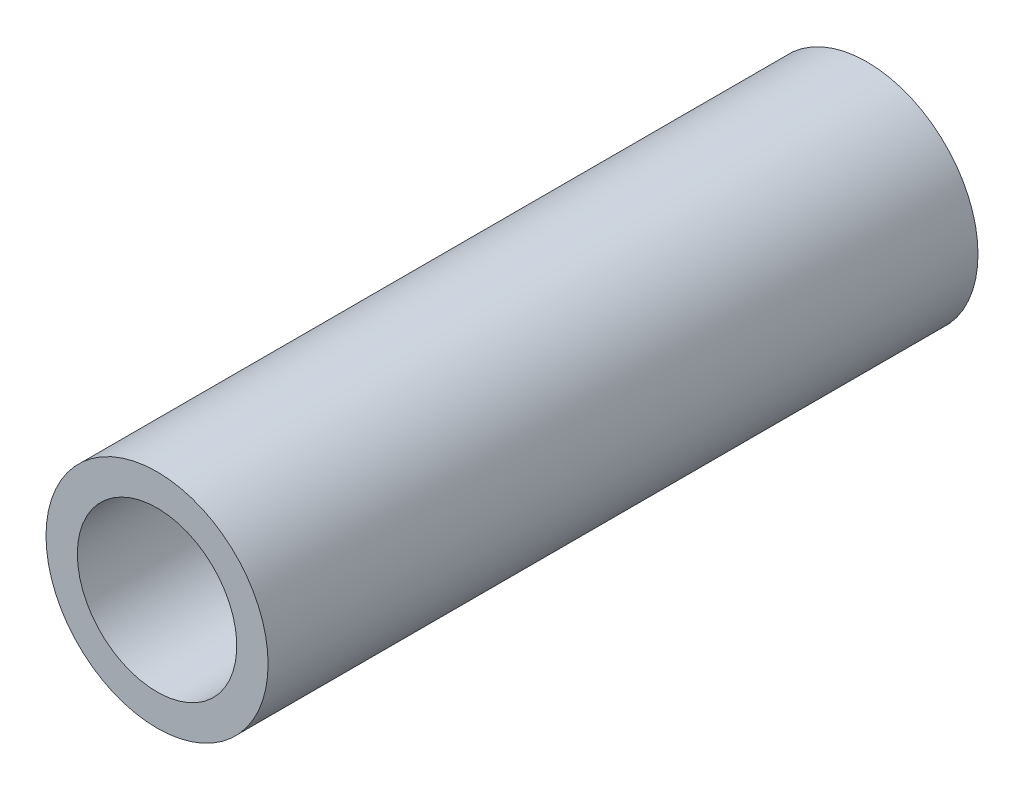
ISO-10303-21;
HEADER;
FILE_DESCRIPTION(('STEP AP214'),'2;1');
FILE_NAME('part.step','',(''),(''),'','','');
FILE_SCHEMA(('AUTOMOTIVE_DESIGN { 1 0 10303 214 1 1 1 1 }'));
ENDSEC;
DATA;
#1=APPLICATION_CONTEXT('core data for automotive mechanical design processes');
#2=APPLICATION_PROTOCOL_DEFINITION('international standard','automotive_design',2000,#1);
#3=PRODUCT_CONTEXT('',#1,'mechanical');
#4=PRODUCT('Part','Part','',(#3));
#5=PRODUCT_RELATED_PRODUCT_CATEGORY('part','',(#4));
#6=PRODUCT_DEFINITION_FORMATION('','',#4);
#7=PRODUCT_DEFINITION_CONTEXT('part definition',#1,'design');
#8=PRODUCT_DEFINITION('design','',#6,#7);
#9=PRODUCT_DEFINITION_SHAPE('','',#8);
#10=(LENGTH_UNIT() NAMED_UNIT(*) SI_UNIT(.MILLI.,.METRE.));
#11=(NAMED_UNIT(*) PLANE_ANGLE_UNIT() SI_UNIT($,.RADIAN.));
#12=(NAMED_UNIT(*) SI_UNIT($,.STERADIAN.) SOLID_ANGLE_UNIT());
#13=UNCERTAINTY_MEASURE_WITH_UNIT(LENGTH_MEASURE(1.E-05),#10,'distance_accuracy_value','');
#14=(GEOMETRIC_REPRESENTATION_CONTEXT(3) GLOBAL_UNCERTAINTY_ASSIGNED_CONTEXT((#13)) GLOBAL_UNIT_ASSIGNED_CONTEXT((#10,
#11,#12)) REPRESENTATION_CONTEXT('',''));
#15=CARTESIAN_POINT('',(0.,0.,0.));
#16=DIRECTION('',(0.,0.,1.));
#17=DIRECTION('',(1.,0.,0.));
#18=AXIS2_PLACEMENT_3D('',#15,#16,#17);
#19=CARTESIAN_POINT('',(0.,0.,89.5));
#20=DIRECTION('',(0.,0.,1.));
#21=DIRECTION('',(1.,0.,0.));
#22=AXIS2_PLACEMENT_3D('',#19,#20,#21);
#23=PLANE('',#22);
#24=CARTESIAN_POINT('',(0.,0.,89.5));
#25=DIRECTION('',(0.,0.,1.));
#26=DIRECTION('',(1.,0.,0.));
#27=AXIS2_PLACEMENT_3D('',#24,#25,#26);
#28=CIRCLE('',#27,14.);
#29=CARTESIAN_POINT('',(-14.,0.,89.5));
#30=VERTEX_POINT('',#29);
#31=EDGE_CURVE('E10',#30,#30,#28,.T.);
#32=ORIENTED_EDGE('',*,*,#31,.T.);
#33=EDGE_LOOP('',(#32));
#34=FACE_BOUND('',#33,.T.);
#35=CARTESIAN_POINT('',(0.,0.,89.5));
#36=DIRECTION('',(0.,0.,1.));
#37=DIRECTION('',(1.,0.,0.));
#38=AXIS2_PLACEMENT_3D('',#35,#36,#37);
#39=CIRCLE('',#38,10.05);
#40=CARTESIAN_POINT('',(-10.05,0.,89.5));
#41=VERTEX_POINT('',#40);
#42=EDGE_CURVE('E46',#41,#41,#39,.T.);
#43=ORIENTED_EDGE('',*,*,#42,.F.);
#44=EDGE_LOOP('',(#43));
#45=FACE_BOUND('',#44,.T.);
#46=ADVANCED_FACE('F35',(#34,#45),#23,.T.);
#47=CARTESIAN_POINT('',(0.,0.,0.));
#48=DIRECTION('',(0.,0.,1.));
#49=DIRECTION('',(1.,0.,0.));
#50=AXIS2_PLACEMENT_3D('',#47,#48,#49);
#51=PLANE('',#50);
#52=CARTESIAN_POINT('',(0.,0.,0.));
#53=DIRECTION('',(0.,0.,1.));
#54=DIRECTION('',(1.,0.,0.));
#55=AXIS2_PLACEMENT_3D('',#52,#53,#54);
#56=CIRCLE('',#55,14.);
#57=CARTESIAN_POINT('',(-14.,0.,0.));
#58=VERTEX_POINT('',#57);
#59=EDGE_CURVE('E39',#58,#58,#56,.T.);
#60=ORIENTED_EDGE('',*,*,#59,.F.);
#61=EDGE_LOOP('',(#60));
#62=FACE_BOUND('',#61,.T.);
#63=CARTESIAN_POINT('',(0.,0.,0.));
#64=DIRECTION('',(0.,0.,1.));
#65=DIRECTION('',(1.,0.,0.));
#66=AXIS2_PLACEMENT_3D('',#63,#64,#65);
#67=CIRCLE('',#66,10.05);
#68=CARTESIAN_POINT('',(-10.05,0.,0.));
#69=VERTEX_POINT('',#68);
#70=EDGE_CURVE('E48',#69,#69,#67,.T.);
#71=ORIENTED_EDGE('',*,*,#70,.T.);
#72=EDGE_LOOP('',(#71));
#73=FACE_BOUND('',#72,.T.);
#74=ADVANCED_FACE('F58',(#62,#73),#51,.F.);
#75=CARTESIAN_POINT('',(0.,0.,89.5));
#76=DIRECTION('',(0.,0.,-1.));
#77=DIRECTION('',(-1.,0.,0.));
#78=AXIS2_PLACEMENT_3D('',#75,#76,#77);
#79=CYLINDRICAL_SURFACE('',#78,14.);
#80=CARTESIAN_POINT('',(-14.,0.,89.5));
#81=CARTESIAN_POINT('',(-14.,0.,88.5677083333333));
#82=CARTESIAN_POINT('',(-14.,0.,87.6354166666667));
#83=CARTESIAN_POINT('',(-14.,0.,85.7708333333333));
#84=CARTESIAN_POINT('',(-14.,0.,84.8385416666667));
#85=CARTESIAN_POINT('',(-14.,0.,82.9739583333333));
#86=CARTESIAN_POINT('',(-14.,0.,82.0416666666667));
#87=CARTESIAN_POINT('',(-14.,0.,80.1770833333333));
#88=CARTESIAN_POINT('',(-14.,0.,79.2447916666667));
#89=CARTESIAN_POINT('',(-14.,0.,77.3802083333333));
#90=CARTESIAN_POINT('',(-14.,0.,76.4479166666667));
#91=CARTESIAN_POINT('',(-14.,0.,74.5833333333333));
#92=CARTESIAN_POINT('',(-14.,0.,73.6510416666667));
#93=CARTESIAN_POINT('',(-14.,0.,71.7864583333333));
#94=CARTESIAN_POINT('',(-14.,0.,70.8541666666667));
#95=CARTESIAN_POINT('',(-14.,0.,68.9895833333333));
#96=CARTESIAN_POINT('',(-14.,0.,68.0572916666667));
#97=CARTESIAN_POINT('',(-14.,0.,66.1927083333333));
#98=CARTESIAN_POINT('',(-14.,0.,65.2604166666667));
#99=CARTESIAN_POINT('',(-14.,0.,63.3958333333333));
#100=CARTESIAN_POINT('',(-14.,0.,62.4635416666667));
#101=CARTESIAN_POINT('',(-14.,0.,60.5989583333333));
#102=CARTESIAN_POINT('',(-14.,0.,59.6666666666667));
#103=CARTESIAN_POINT('',(-14.,0.,57.8020833333333));
#104=CARTESIAN_POINT('',(-14.,0.,56.8697916666667));
#105=CARTESIAN_POINT('',(-14.,0.,55.0052083333333));
#106=CARTESIAN_POINT('',(-14.,0.,54.0729166666667));
#107=CARTESIAN_POINT('',(-14.,0.,52.2083333333333));
#108=CARTESIAN_POINT('',(-14.,0.,51.2760416666667));
#109=CARTESIAN_POINT('',(-14.,0.,49.4114583333333));
#110=CARTESIAN_POINT('',(-14.,0.,48.4791666666667));
#111=CARTESIAN_POINT('',(-14.,0.,46.6145833333333));
#112=CARTESIAN_POINT('',(-14.,0.,45.6822916666667));
#113=CARTESIAN_POINT('',(-14.,0.,43.8177083333333));
#114=CARTESIAN_POINT('',(-14.,0.,42.8854166666667));
#115=CARTESIAN_POINT('',(-14.,0.,41.0208333333333));
#116=CARTESIAN_POINT('',(-14.,0.,40.0885416666667));
#117=CARTESIAN_POINT('',(-14.,0.,38.2239583333333));
#118=CARTESIAN_POINT('',(-14.,0.,37.2916666666667));
#119=CARTESIAN_POINT('',(-14.,0.,35.4270833333333));
#120=CARTESIAN_POINT('',(-14.,0.,34.4947916666667));
#121=CARTESIAN_POINT('',(-14.,0.,32.6302083333333));
#122=CARTESIAN_POINT('',(-14.,0.,31.6979166666666));
#123=CARTESIAN_POINT('',(-14.,0.,29.8333333333333));
#124=CARTESIAN_POINT('',(-14.,0.,28.9010416666666));
#125=CARTESIAN_POINT('',(-14.,0.,27.0364583333333));
#126=CARTESIAN_POINT('',(-14.,0.,26.1041666666667));
#127=CARTESIAN_POINT('',(-14.,0.,24.2395833333333));
#128=CARTESIAN_POINT('',(-14.,0.,23.3072916666667));
#129=CARTESIAN_POINT('',(-14.,0.,21.4427083333333));
#130=CARTESIAN_POINT('',(-14.,0.,20.5104166666667));
#131=CARTESIAN_POINT('',(-14.,0.,18.6458333333333));
#132=CARTESIAN_POINT('',(-14.,0.,17.7135416666667));
#133=CARTESIAN_POINT('',(-14.,0.,15.8489583333333));
#134=CARTESIAN_POINT('',(-14.,0.,14.9166666666667));
#135=CARTESIAN_POINT('',(-14.,0.,13.0520833333333));
#136=CARTESIAN_POINT('',(-14.,0.,12.1197916666667));
#137=CARTESIAN_POINT('',(-14.,0.,10.2552083333333));
#138=CARTESIAN_POINT('',(-14.,0.,9.32291666666665));
#139=CARTESIAN_POINT('',(-14.,0.,7.45833333333332));
#140=CARTESIAN_POINT('',(-14.,0.,6.52604166666666));
#141=CARTESIAN_POINT('',(-14.,0.,4.66145833333333));
#142=CARTESIAN_POINT('',(-14.,0.,3.72916666666666));
#143=CARTESIAN_POINT('',(-14.,0.,1.86458333333332));
#144=CARTESIAN_POINT('',(-14.,0.,0.932291666666654));
#145=CARTESIAN_POINT('',(-14.,0.,0.));
#146=B_SPLINE_CURVE_WITH_KNOTS('',3,(#80,#81,#82,#83,#84,#85,#86,#87,#88,#89,#90,#91,#92,#93,
#94,#95,#96,#97,#98,#99,#100,#101,#102,#103,#104,#105,#106,#107,#108,#109,#110,#111,#112,#113,
#114,#115,#116,#117,#118,#119,#120,#121,#122,#123,#124,#125,#126,#127,#128,#129,#130,#131,#132,
#133,#134,#135,#136,#137,#138,#139,#140,#141,#142,#143,#144,#145),.UNSPECIFIED.,.F.,.F.,(4,2,2,
2,2,2,2,2,2,2,2,2,2,2,2,2,2,2,2,2,2,2,2,2,2,2,2,2,2,2,2,2,4),(0.,2.796875,5.59375000000001,
8.39062500000001,11.1875,13.984375,16.78125,19.578125,22.375,25.171875,27.96875,30.765625,
33.5625,36.359375,39.15625,41.953125,44.75,47.546875,50.34375,53.140625,55.9375,58.734375,
61.53125,64.328125,67.125,69.921875,72.71875,75.515625,78.3125,81.109375,83.90625,86.703125,
89.5),.UNSPECIFIED.);
#147=EDGE_CURVE('BSEAM37',#30,#58,#146,.T.);
#148=ORIENTED_EDGE('',*,*,#31,.F.);
#149=ORIENTED_EDGE('',*,*,#59,.T.);
#150=ORIENTED_EDGE('',*,*,#147,.T.);
#151=ORIENTED_EDGE('',*,*,#147,.F.);
#152=EDGE_LOOP('',(#148,#150,#149,#151));
#153=FACE_BOUND('',#152,.T.);
#154=ADVANCED_FACE('F37',(#153),#79,.T.);
#155=CARTESIAN_POINT('',(0.,0.,89.5));
#156=DIRECTION('',(0.,0.,-1.));
#157=DIRECTION('',(-1.,0.,0.));
#158=AXIS2_PLACEMENT_3D('',#155,#156,#157);
#159=CYLINDRICAL_SURFACE('',#158,10.05);
#160=CARTESIAN_POINT('',(-10.05,0.,89.5));
#161=CARTESIAN_POINT('',(-10.05,0.,88.5677083333333));
#162=CARTESIAN_POINT('',(-10.05,0.,87.6354166666667));
#163=CARTESIAN_POINT('',(-10.05,0.,85.7708333333333));
#164=CARTESIAN_POINT('',(-10.05,0.,84.8385416666667));
#165=CARTESIAN_POINT('',(-10.05,0.,82.9739583333333));
#166=CARTESIAN_POINT('',(-10.05,0.,82.0416666666667));
#167=CARTESIAN_POINT('',(-10.05,0.,80.1770833333333));
#168=CARTESIAN_POINT('',(-10.05,0.,79.2447916666667));
#169=CARTESIAN_POINT('',(-10.05,0.,77.3802083333333));
#170=CARTESIAN_POINT('',(-10.05,0.,76.4479166666667));
#171=CARTESIAN_POINT('',(-10.05,0.,74.5833333333333));
#172=CARTESIAN_POINT('',(-10.05,0.,73.6510416666667));
#173=CARTESIAN_POINT('',(-10.05,0.,71.7864583333333));
#174=CARTESIAN_POINT('',(-10.05,0.,70.8541666666667));
#175=CARTESIAN_POINT('',(-10.05,0.,68.9895833333333));
#176=CARTESIAN_POINT('',(-10.05,0.,68.0572916666667));
#177=CARTESIAN_POINT('',(-10.05,0.,66.1927083333333));
#178=CARTESIAN_POINT('',(-10.05,0.,65.2604166666667));
#179=CARTESIAN_POINT('',(-10.05,0.,63.3958333333333));
#180=CARTESIAN_POINT('',(-10.05,0.,62.4635416666667));
#181=CARTESIAN_POINT('',(-10.05,0.,60.5989583333333));
#182=CARTESIAN_POINT('',(-10.05,0.,59.6666666666667));
#183=CARTESIAN_POINT('',(-10.05,0.,57.8020833333333));
#184=CARTESIAN_POINT('',(-10.05,0.,56.8697916666667));
#185=CARTESIAN_POINT('',(-10.05,0.,55.0052083333333));
#186=CARTESIAN_POINT('',(-10.05,0.,54.0729166666667));
#187=CARTESIAN_POINT('',(-10.05,0.,52.2083333333333));
#188=CARTESIAN_POINT('',(-10.05,0.,51.2760416666667));
#189=CARTESIAN_POINT('',(-10.05,0.,49.4114583333333));
#190=CARTESIAN_POINT('',(-10.05,0.,48.4791666666667));
#191=CARTESIAN_POINT('',(-10.05,0.,46.6145833333333));
#192=CARTESIAN_POINT('',(-10.05,0.,45.6822916666667));
#193=CARTESIAN_POINT('',(-10.05,0.,43.8177083333333));
#194=CARTESIAN_POINT('',(-10.05,0.,42.8854166666667));
#195=CARTESIAN_POINT('',(-10.05,0.,41.0208333333333));
#196=CARTESIAN_POINT('',(-10.05,0.,40.0885416666667));
#197=CARTESIAN_POINT('',(-10.05,0.,38.2239583333333));
#198=CARTESIAN_POINT('',(-10.05,0.,37.2916666666667));
#199=CARTESIAN_POINT('',(-10.05,0.,35.4270833333333));
#200=CARTESIAN_POINT('',(-10.05,0.,34.4947916666667));
#201=CARTESIAN_POINT('',(-10.05,0.,32.6302083333333));
#202=CARTESIAN_POINT('',(-10.05,0.,31.6979166666667));
#203=CARTESIAN_POINT('',(-10.05,0.,29.8333333333333));
#204=CARTESIAN_POINT('',(-10.05,0.,28.9010416666667));
#205=CARTESIAN_POINT('',(-10.05,0.,27.0364583333333));
#206=CARTESIAN_POINT('',(-10.05,0.,26.1041666666667));
#207=CARTESIAN_POINT('',(-10.05,0.,24.2395833333333));
#208=CARTESIAN_POINT('',(-10.05,0.,23.3072916666667));
#209=CARTESIAN_POINT('',(-10.05,0.,21.4427083333333));
#210=CARTESIAN_POINT('',(-10.05,0.,20.5104166666667));
#211=CARTESIAN_POINT('',(-10.05,0.,18.6458333333333));
#212=CARTESIAN_POINT('',(-10.05,0.,17.7135416666667));
#213=CARTESIAN_POINT('',(-10.05,0.,15.8489583333333));
#214=CARTESIAN_POINT('',(-10.05,0.,14.9166666666667));
#215=CARTESIAN_POINT('',(-10.05,0.,13.0520833333333));
#216=CARTESIAN_POINT('',(-10.05,0.,12.1197916666667));
#217=CARTESIAN_POINT('',(-10.05,0.,10.2552083333333));
#218=CARTESIAN_POINT('',(-10.05,0.,9.32291666666665));
#219=CARTESIAN_POINT('',(-10.05,0.,7.45833333333332));
#220=CARTESIAN_POINT('',(-10.05,0.,6.52604166666665));
#221=CARTESIAN_POINT('',(-10.05,0.,4.66145833333332));
#222=CARTESIAN_POINT('',(-10.05,0.,3.72916666666665));
#223=CARTESIAN_POINT('',(-10.05,0.,1.86458333333332));
#224=CARTESIAN_POINT('',(-10.05,0.,0.932291666666654));
#225=CARTESIAN_POINT('',(-10.05,0.,0.));
#226=B_SPLINE_CURVE_WITH_KNOTS('',3,(#160,#161,#162,#163,#164,#165,#166,#167,#168,#169,#170,
#171,#172,#173,#174,#175,#176,#177,#178,#179,#180,#181,#182,#183,#184,#185,#186,#187,#188,#189,
#190,#191,#192,#193,#194,#195,#196,#197,#198,#199,#200,#201,#202,#203,#204,#205,#206,#207,#208,
#209,#210,#211,#212,#213,#214,#215,#216,#217,#218,#219,#220,#221,#222,#223,#224,#225),
.UNSPECIFIED.,.F.,.F.,(4,2,2,2,2,2,2,2,2,2,2,2,2,2,2,2,2,2,2,2,2,2,2,2,2,2,2,2,2,2,2,2,4),(0.,
2.79687499999999,5.59374999999999,8.390625,11.1875,13.984375,16.78125,19.578125,22.375,
25.171875,27.96875,30.765625,33.5625,36.359375,39.15625,41.953125,44.75,47.546875,50.34375,
53.140625,55.9375,58.734375,61.53125,64.328125,67.125,69.921875,72.71875,75.515625,78.3125,
81.109375,83.90625,86.703125,89.5),.UNSPECIFIED.);
#227=EDGE_CURVE('BSEAM54',#41,#69,#226,.T.);
#228=ORIENTED_EDGE('',*,*,#42,.T.);
#229=ORIENTED_EDGE('',*,*,#70,.F.);
#230=ORIENTED_EDGE('',*,*,#227,.T.);
#231=ORIENTED_EDGE('',*,*,#227,.F.);
#232=EDGE_LOOP('',(#228,#230,#229,#231));
#233=FACE_BOUND('',#232,.T.);
#234=ADVANCED_FACE('F54',(#233),#159,.F.);
#235=CLOSED_SHELL('',(#46,#74,#154,#234));
#236=MANIFOLD_SOLID_BREP('B2',#235);
#237=ADVANCED_BREP_SHAPE_REPRESENTATION('',(#18,#236),#14);
#238=SHAPE_DEFINITION_REPRESENTATION(#9,#237);
ENDSEC;
END-ISO-10303-21;
